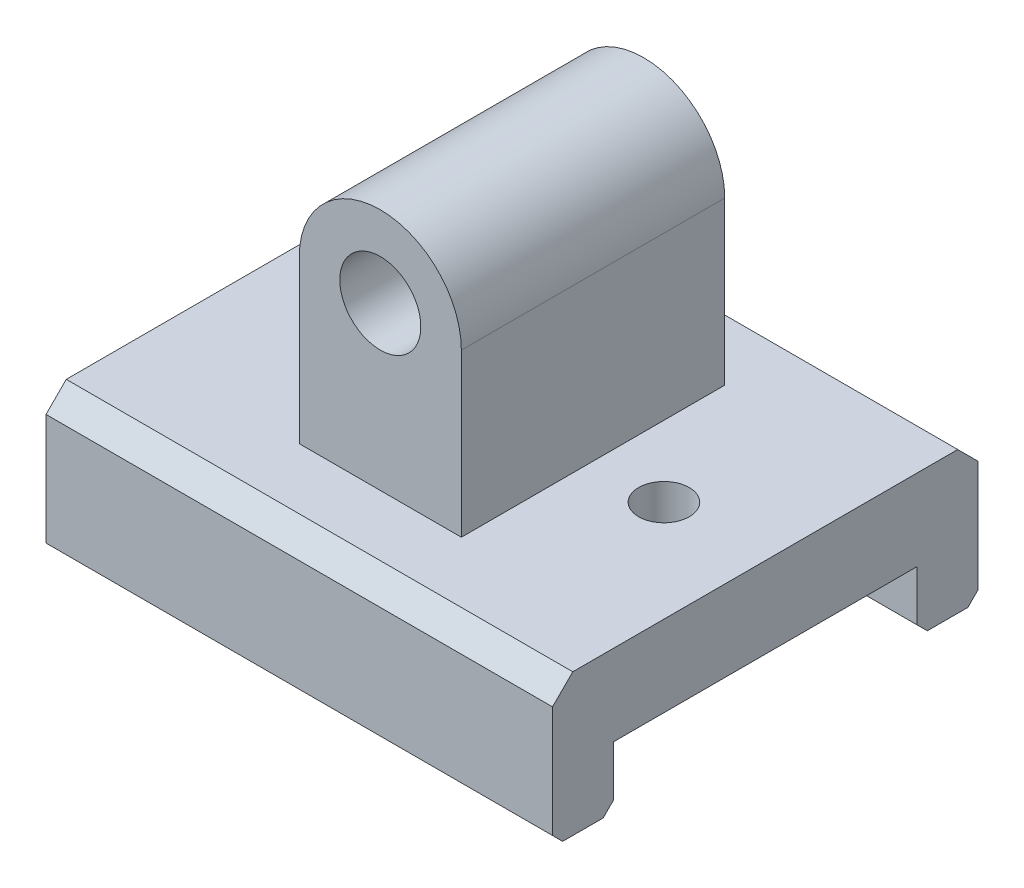
ISO-10303-21;
HEADER;
FILE_DESCRIPTION(('STEP AP214'),'2;1');
FILE_NAME('part.step','',(''),(''),'','','');
FILE_SCHEMA(('AUTOMOTIVE_DESIGN { 1 0 10303 214 1 1 1 1 }'));
ENDSEC;
DATA;
#1=APPLICATION_CONTEXT('core data for automotive mechanical design processes');
#2=APPLICATION_PROTOCOL_DEFINITION('international standard','automotive_design',2000,#1);
#3=PRODUCT_CONTEXT('',#1,'mechanical');
#4=PRODUCT('Part','Part','',(#3));
#5=PRODUCT_RELATED_PRODUCT_CATEGORY('part','',(#4));
#6=PRODUCT_DEFINITION_FORMATION('','',#4);
#7=PRODUCT_DEFINITION_CONTEXT('part definition',#1,'design');
#8=PRODUCT_DEFINITION('design','',#6,#7);
#9=PRODUCT_DEFINITION_SHAPE('','',#8);
#10=(LENGTH_UNIT() NAMED_UNIT(*) SI_UNIT(.MILLI.,.METRE.));
#11=(NAMED_UNIT(*) PLANE_ANGLE_UNIT() SI_UNIT($,.RADIAN.));
#12=(NAMED_UNIT(*) SI_UNIT($,.STERADIAN.) SOLID_ANGLE_UNIT());
#13=UNCERTAINTY_MEASURE_WITH_UNIT(LENGTH_MEASURE(1.E-05),#10,'distance_accuracy_value','');
#14=(GEOMETRIC_REPRESENTATION_CONTEXT(3) GLOBAL_UNCERTAINTY_ASSIGNED_CONTEXT((#13)) GLOBAL_UNIT_ASSIGNED_CONTEXT((#10,
#11,#12)) REPRESENTATION_CONTEXT('',''));
#15=CARTESIAN_POINT('',(0.,0.,0.));
#16=DIRECTION('',(0.,0.,1.));
#17=DIRECTION('',(1.,0.,0.));
#18=AXIS2_PLACEMENT_3D('',#15,#16,#17);
#19=CARTESIAN_POINT('',(25.,4.,-10.5));
#20=DIRECTION('',(0.,-1.,0.));
#21=DIRECTION('',(0.,0.,-1.));
#22=AXIS2_PLACEMENT_3D('',#19,#20,#21);
#23=PLANE('',#22);
#24=CARTESIAN_POINT('',(5.,4.,0.));
#25=DIRECTION('',(0.,1.,0.));
#26=DIRECTION('',(0.,0.,1.));
#27=AXIS2_PLACEMENT_3D('',#24,#25,#26);
#28=CIRCLE('',#27,1.24999999999999);
#29=CARTESIAN_POINT('',(5.,4.,1.24999999999999));
#30=VERTEX_POINT('',#29);
#31=EDGE_CURVE('E596',#30,#30,#28,.T.);
#32=ORIENTED_EDGE('',*,*,#31,.F.);
#33=EDGE_LOOP('',(#32));
#34=FACE_BOUND('',#33,.T.);
#35=CARTESIAN_POINT('',(20.,4.,0.));
#36=DIRECTION('',(0.,1.,0.));
#37=DIRECTION('',(0.,0.,1.));
#38=AXIS2_PLACEMENT_3D('',#35,#36,#37);
#39=CIRCLE('',#38,1.24999999999999);
#40=CARTESIAN_POINT('',(20.,4.,1.24999999999999));
#41=VERTEX_POINT('',#40);
#42=EDGE_CURVE('E391',#41,#41,#39,.T.);
#43=ORIENTED_EDGE('',*,*,#42,.F.);
#44=EDGE_LOOP('',(#43));
#45=FACE_BOUND('',#44,.T.);
#46=DIRECTION('',(0.,0.,1.));
#47=VECTOR('',#46,1.);
#48=CARTESIAN_POINT('',(25.,4.,-10.5));
#49=LINE('',#48,#47);
#50=CARTESIAN_POINT('',(25.,4.,-9.5));
#51=VERTEX_POINT('',#50);
#52=CARTESIAN_POINT('',(25.,4.,9.49999999999999));
#53=VERTEX_POINT('',#52);
#54=EDGE_CURVE('E211',#51,#53,#49,.T.);
#55=ORIENTED_EDGE('',*,*,#54,.F.);
#56=DIRECTION('',(-1.,0.,0.));
#57=VECTOR('',#56,1.);
#58=CARTESIAN_POINT('',(25.,4.,-9.5));
#59=LINE('',#58,#57);
#60=CARTESIAN_POINT('',(0.,4.,-9.5));
#61=VERTEX_POINT('',#60);
#62=EDGE_CURVE('E243',#51,#61,#59,.T.);
#63=ORIENTED_EDGE('',*,*,#62,.T.);
#64=DIRECTION('',(0.,0.,1.));
#65=VECTOR('',#64,1.);
#66=CARTESIAN_POINT('',(0.,4.,-10.5));
#67=LINE('',#66,#65);
#68=CARTESIAN_POINT('',(0.,4.,9.49999999999999));
#69=VERTEX_POINT('',#68);
#70=EDGE_CURVE('E228',#61,#69,#67,.T.);
#71=ORIENTED_EDGE('',*,*,#70,.T.);
#72=DIRECTION('',(1.,0.,0.));
#73=VECTOR('',#72,1.);
#74=CARTESIAN_POINT('',(25.,4.,9.49999999999999));
#75=LINE('',#74,#73);
#76=EDGE_CURVE('E241',#69,#53,#75,.T.);
#77=ORIENTED_EDGE('',*,*,#76,.T.);
#78=EDGE_LOOP('',(#55,#63,#71,#77));
#79=FACE_BOUND('',#78,.T.);
#80=DIRECTION('',(0.,0.,-1.));
#81=VECTOR('',#80,1.);
#82=CARTESIAN_POINT('',(8.5,4.,6.5));
#83=LINE('',#82,#81);
#84=CARTESIAN_POINT('',(8.5,4.,6.5));
#85=VERTEX_POINT('',#84);
#86=CARTESIAN_POINT('',(8.5,4.,-6.5));
#87=VERTEX_POINT('',#86);
#88=EDGE_CURVE('E172',#85,#87,#83,.T.);
#89=ORIENTED_EDGE('',*,*,#88,.T.);
#90=DIRECTION('',(1.,0.,0.));
#91=VECTOR('',#90,1.);
#92=CARTESIAN_POINT('',(8.5,4.,-6.5));
#93=LINE('',#92,#91);
#94=CARTESIAN_POINT('',(16.5,4.,-6.5));
#95=VERTEX_POINT('',#94);
#96=EDGE_CURVE('E408',#87,#95,#93,.T.);
#97=ORIENTED_EDGE('',*,*,#96,.T.);
#98=DIRECTION('',(0.,0.,-1.));
#99=VECTOR('',#98,1.);
#100=CARTESIAN_POINT('',(16.5,4.,6.5));
#101=LINE('',#100,#99);
#102=CARTESIAN_POINT('',(16.5,4.,6.5));
#103=VERTEX_POINT('',#102);
#104=EDGE_CURVE('E195',#103,#95,#101,.T.);
#105=ORIENTED_EDGE('',*,*,#104,.F.);
#106=DIRECTION('',(1.,0.,0.));
#107=VECTOR('',#106,1.);
#108=CARTESIAN_POINT('',(8.5,4.,6.5));
#109=LINE('',#108,#107);
#110=EDGE_CURVE('E175',#85,#103,#109,.T.);
#111=ORIENTED_EDGE('',*,*,#110,.F.);
#112=EDGE_LOOP('',(#89,#97,#105,#111));
#113=FACE_BOUND('',#112,.T.);
#114=ADVANCED_FACE('F37',(#34,#45,#79,#113),#23,.F.);
#115=CARTESIAN_POINT('',(25.,-3.,7.5));
#116=DIRECTION('',(0.,0.,1.));
#117=DIRECTION('',(1.,0.,0.));
#118=AXIS2_PLACEMENT_3D('',#115,#116,#117);
#119=PLANE('',#118);
#120=DIRECTION('',(0.,1.,0.));
#121=VECTOR('',#120,1.);
#122=CARTESIAN_POINT('',(25.,-3.,7.5));
#123=LINE('',#122,#121);
#124=CARTESIAN_POINT('',(25.,-2.5,7.5));
#125=VERTEX_POINT('',#124);
#126=CARTESIAN_POINT('',(25.,0.,7.5));
#127=VERTEX_POINT('',#126);
#128=EDGE_CURVE('E199',#125,#127,#123,.T.);
#129=ORIENTED_EDGE('',*,*,#128,.F.);
#130=DIRECTION('',(-1.,0.,0.));
#131=VECTOR('',#130,1.);
#132=CARTESIAN_POINT('',(25.,-2.5,7.5));
#133=LINE('',#132,#131);
#134=CARTESIAN_POINT('',(0.,-2.5,7.5));
#135=VERTEX_POINT('',#134);
#136=EDGE_CURVE('E11',#125,#135,#133,.T.);
#137=ORIENTED_EDGE('',*,*,#136,.T.);
#138=DIRECTION('',(0.,1.,0.));
#139=VECTOR('',#138,1.);
#140=CARTESIAN_POINT('',(0.,-3.,7.5));
#141=LINE('',#140,#139);
#142=CARTESIAN_POINT('',(0.,0.,7.5));
#143=VERTEX_POINT('',#142);
#144=EDGE_CURVE('E191',#135,#143,#141,.T.);
#145=ORIENTED_EDGE('',*,*,#144,.T.);
#146=DIRECTION('',(-1.,0.,0.));
#147=VECTOR('',#146,1.);
#148=CARTESIAN_POINT('',(25.,0.,7.5));
#149=LINE('',#148,#147);
#150=EDGE_CURVE('E238',#127,#143,#149,.T.);
#151=ORIENTED_EDGE('',*,*,#150,.F.);
#152=EDGE_LOOP('',(#129,#137,#145,#151));
#153=FACE_BOUND('',#152,.T.);
#154=ADVANCED_FACE('F315',(#153),#119,.F.);
#155=CARTESIAN_POINT('',(25.,0.,7.5));
#156=DIRECTION('',(0.,1.,0.));
#157=DIRECTION('',(0.,0.,1.));
#158=AXIS2_PLACEMENT_3D('',#155,#156,#157);
#159=PLANE('',#158);
#160=CARTESIAN_POINT('',(5.,0.,0.));
#161=DIRECTION('',(0.,1.,0.));
#162=DIRECTION('',(0.,0.,1.));
#163=AXIS2_PLACEMENT_3D('',#160,#161,#162);
#164=CIRCLE('',#163,1.24999999999999);
#165=CARTESIAN_POINT('',(5.,0.,1.24999999999999));
#166=VERTEX_POINT('',#165);
#167=EDGE_CURVE('E385',#166,#166,#164,.T.);
#168=ORIENTED_EDGE('',*,*,#167,.T.);
#169=EDGE_LOOP('',(#168));
#170=FACE_BOUND('',#169,.T.);
#171=CARTESIAN_POINT('',(20.,0.,0.));
#172=DIRECTION('',(0.,1.,0.));
#173=DIRECTION('',(0.,0.,1.));
#174=AXIS2_PLACEMENT_3D('',#171,#172,#173);
#175=CIRCLE('',#174,1.24999999999999);
#176=CARTESIAN_POINT('',(20.,0.,1.24999999999999));
#177=VERTEX_POINT('',#176);
#178=EDGE_CURVE('E388',#177,#177,#175,.T.);
#179=ORIENTED_EDGE('',*,*,#178,.T.);
#180=EDGE_LOOP('',(#179));
#181=FACE_BOUND('',#180,.T.);
#182=DIRECTION('',(0.,0.,-1.));
#183=VECTOR('',#182,1.);
#184=CARTESIAN_POINT('',(0.,0.,7.5));
#185=LINE('',#184,#183);
#186=CARTESIAN_POINT('',(0.,0.,-7.5));
#187=VERTEX_POINT('',#186);
#188=EDGE_CURVE('E193',#143,#187,#185,.T.);
#189=ORIENTED_EDGE('',*,*,#188,.T.);
#190=DIRECTION('',(-1.,0.,0.));
#191=VECTOR('',#190,1.);
#192=CARTESIAN_POINT('',(25.,0.,-7.5));
#193=LINE('',#192,#191);
#194=CARTESIAN_POINT('',(25.,0.,-7.5));
#195=VERTEX_POINT('',#194);
#196=EDGE_CURVE('E218',#195,#187,#193,.T.);
#197=ORIENTED_EDGE('',*,*,#196,.F.);
#198=DIRECTION('',(0.,0.,-1.));
#199=VECTOR('',#198,1.);
#200=CARTESIAN_POINT('',(25.,0.,7.5));
#201=LINE('',#200,#199);
#202=EDGE_CURVE('E201',#127,#195,#201,.T.);
#203=ORIENTED_EDGE('',*,*,#202,.F.);
#204=ORIENTED_EDGE('',*,*,#150,.T.);
#205=EDGE_LOOP('',(#189,#197,#203,#204));
#206=FACE_BOUND('',#205,.T.);
#207=ADVANCED_FACE('F320',(#170,#181,#206),#159,.F.);
#208=CARTESIAN_POINT('',(25.,0.,-7.5));
#209=DIRECTION('',(0.,0.,-1.));
#210=DIRECTION('',(0.,1.,0.));
#211=AXIS2_PLACEMENT_3D('',#208,#209,#210);
#212=PLANE('',#211);
#213=DIRECTION('',(0.,-1.,0.));
#214=VECTOR('',#213,1.);
#215=CARTESIAN_POINT('',(0.,0.,-7.5));
#216=LINE('',#215,#214);
#217=CARTESIAN_POINT('',(0.,-2.5,-7.5));
#218=VERTEX_POINT('',#217);
#219=EDGE_CURVE('E221',#187,#218,#216,.T.);
#220=ORIENTED_EDGE('',*,*,#219,.T.);
#221=DIRECTION('',(1.,0.,0.));
#222=VECTOR('',#221,1.);
#223=CARTESIAN_POINT('',(25.,-2.5,-7.5));
#224=LINE('',#223,#222);
#225=CARTESIAN_POINT('',(25.,-2.5,-7.5));
#226=VERTEX_POINT('',#225);
#227=EDGE_CURVE('E45',#218,#226,#224,.T.);
#228=ORIENTED_EDGE('',*,*,#227,.T.);
#229=DIRECTION('',(0.,-1.,0.));
#230=VECTOR('',#229,1.);
#231=CARTESIAN_POINT('',(25.,0.,-7.5));
#232=LINE('',#231,#230);
#233=EDGE_CURVE('E204',#195,#226,#232,.T.);
#234=ORIENTED_EDGE('',*,*,#233,.F.);
#235=ORIENTED_EDGE('',*,*,#196,.T.);
#236=EDGE_LOOP('',(#220,#228,#234,#235));
#237=FACE_BOUND('',#236,.T.);
#238=ADVANCED_FACE('F322',(#237),#212,.F.);
#239=CARTESIAN_POINT('',(25.,-3.,-7.5));
#240=DIRECTION('',(0.,1.,0.));
#241=DIRECTION('',(0.,0.,1.));
#242=AXIS2_PLACEMENT_3D('',#239,#240,#241);
#243=PLANE('',#242);
#244=DIRECTION('',(0.,0.,-1.));
#245=VECTOR('',#244,1.);
#246=CARTESIAN_POINT('',(0.,-3.,-7.5));
#247=LINE('',#246,#245);
#248=CARTESIAN_POINT('',(0.,-3.,-8.00000000000001));
#249=VERTEX_POINT('',#248);
#250=CARTESIAN_POINT('',(0.,-3.,-10.));
#251=VERTEX_POINT('',#250);
#252=EDGE_CURVE('E223',#249,#251,#247,.T.);
#253=ORIENTED_EDGE('',*,*,#252,.T.);
#254=DIRECTION('',(1.,0.,0.));
#255=VECTOR('',#254,1.);
#256=CARTESIAN_POINT('',(25.,-3.,-10.));
#257=LINE('',#256,#255);
#258=CARTESIAN_POINT('',(25.,-3.,-10.));
#259=VERTEX_POINT('',#258);
#260=EDGE_CURVE('E275',#251,#259,#257,.T.);
#261=ORIENTED_EDGE('',*,*,#260,.T.);
#262=DIRECTION('',(0.,0.,-1.));
#263=VECTOR('',#262,1.);
#264=CARTESIAN_POINT('',(25.,-3.,-7.5));
#265=LINE('',#264,#263);
#266=CARTESIAN_POINT('',(25.,-3.,-8.00000000000001));
#267=VERTEX_POINT('',#266);
#268=EDGE_CURVE('E206',#267,#259,#265,.T.);
#269=ORIENTED_EDGE('',*,*,#268,.F.);
#270=DIRECTION('',(-1.,0.,0.));
#271=VECTOR('',#270,1.);
#272=CARTESIAN_POINT('',(25.,-3.,-8.00000000000001));
#273=LINE('',#272,#271);
#274=EDGE_CURVE('E272',#267,#249,#273,.T.);
#275=ORIENTED_EDGE('',*,*,#274,.T.);
#276=EDGE_LOOP('',(#253,#261,#269,#275));
#277=FACE_BOUND('',#276,.T.);
#278=ADVANCED_FACE('F330',(#277),#243,.F.);
#279=CARTESIAN_POINT('',(25.,-3.,-10.5));
#280=DIRECTION('',(0.,0.,1.));
#281=DIRECTION('',(0.,-1.,0.));
#282=AXIS2_PLACEMENT_3D('',#279,#280,#281);
#283=PLANE('',#282);
#284=DIRECTION('',(0.,1.,0.));
#285=VECTOR('',#284,1.);
#286=CARTESIAN_POINT('',(25.,-3.,-10.5));
#287=LINE('',#286,#285);
#288=CARTESIAN_POINT('',(25.,-2.49999999999999,-10.5));
#289=VERTEX_POINT('',#288);
#290=CARTESIAN_POINT('',(25.,3.,-10.5));
#291=VERTEX_POINT('',#290);
#292=EDGE_CURVE('E209',#289,#291,#287,.T.);
#293=ORIENTED_EDGE('',*,*,#292,.F.);
#294=DIRECTION('',(-1.,0.,0.));
#295=VECTOR('',#294,1.);
#296=CARTESIAN_POINT('',(25.,-2.49999999999999,-10.5));
#297=LINE('',#296,#295);
#298=CARTESIAN_POINT('',(0.,-2.49999999999999,-10.5));
#299=VERTEX_POINT('',#298);
#300=EDGE_CURVE('E261',#289,#299,#297,.T.);
#301=ORIENTED_EDGE('',*,*,#300,.T.);
#302=DIRECTION('',(0.,1.,0.));
#303=VECTOR('',#302,1.);
#304=CARTESIAN_POINT('',(0.,-3.,-10.5));
#305=LINE('',#304,#303);
#306=CARTESIAN_POINT('',(0.,3.,-10.5));
#307=VERTEX_POINT('',#306);
#308=EDGE_CURVE('E226',#299,#307,#305,.T.);
#309=ORIENTED_EDGE('',*,*,#308,.T.);
#310=DIRECTION('',(1.,0.,0.));
#311=VECTOR('',#310,1.);
#312=CARTESIAN_POINT('',(25.,3.,-10.5));
#313=LINE('',#312,#311);
#314=EDGE_CURVE('E251',#307,#291,#313,.T.);
#315=ORIENTED_EDGE('',*,*,#314,.T.);
#316=EDGE_LOOP('',(#293,#301,#309,#315));
#317=FACE_BOUND('',#316,.T.);
#318=ADVANCED_FACE('F338',(#317),#283,.F.);
#319=CARTESIAN_POINT('',(25.,4.,10.5));
#320=DIRECTION('',(0.,0.,-1.));
#321=DIRECTION('',(-1.,0.,0.));
#322=AXIS2_PLACEMENT_3D('',#319,#320,#321);
#323=PLANE('',#322);
#324=DIRECTION('',(0.,-1.,0.));
#325=VECTOR('',#324,1.);
#326=CARTESIAN_POINT('',(0.,4.,10.5));
#327=LINE('',#326,#325);
#328=CARTESIAN_POINT('',(0.,2.99999999999999,10.5));
#329=VERTEX_POINT('',#328);
#330=CARTESIAN_POINT('',(0.,-2.49999999999999,10.5));
#331=VERTEX_POINT('',#330);
#332=EDGE_CURVE('E231',#329,#331,#327,.T.);
#333=ORIENTED_EDGE('',*,*,#332,.T.);
#334=DIRECTION('',(1.,0.,0.));
#335=VECTOR('',#334,1.);
#336=CARTESIAN_POINT('',(25.,-2.49999999999999,10.5));
#337=LINE('',#336,#335);
#338=CARTESIAN_POINT('',(25.,-2.49999999999999,10.5));
#339=VERTEX_POINT('',#338);
#340=EDGE_CURVE('E289',#331,#339,#337,.T.);
#341=ORIENTED_EDGE('',*,*,#340,.T.);
#342=DIRECTION('',(0.,-1.,0.));
#343=VECTOR('',#342,1.);
#344=CARTESIAN_POINT('',(25.,4.,10.5));
#345=LINE('',#344,#343);
#346=CARTESIAN_POINT('',(25.,2.99999999999999,10.5));
#347=VERTEX_POINT('',#346);
#348=EDGE_CURVE('E214',#347,#339,#345,.T.);
#349=ORIENTED_EDGE('',*,*,#348,.F.);
#350=DIRECTION('',(-1.,0.,0.));
#351=VECTOR('',#350,1.);
#352=CARTESIAN_POINT('',(25.,2.99999999999999,10.5));
#353=LINE('',#352,#351);
#354=EDGE_CURVE('E258',#347,#329,#353,.T.);
#355=ORIENTED_EDGE('',*,*,#354,.T.);
#356=EDGE_LOOP('',(#333,#341,#349,#355));
#357=FACE_BOUND('',#356,.T.);
#358=ADVANCED_FACE('F293',(#357),#323,.F.);
#359=CARTESIAN_POINT('',(25.,-3.,10.5));
#360=DIRECTION('',(0.,1.,0.));
#361=DIRECTION('',(0.,0.,1.));
#362=AXIS2_PLACEMENT_3D('',#359,#360,#361);
#363=PLANE('',#362);
#364=DIRECTION('',(0.,0.,-1.));
#365=VECTOR('',#364,1.);
#366=CARTESIAN_POINT('',(25.,-3.,10.5));
#367=LINE('',#366,#365);
#368=CARTESIAN_POINT('',(25.,-3.,9.99999999999999));
#369=VERTEX_POINT('',#368);
#370=CARTESIAN_POINT('',(25.,-3.,8.));
#371=VERTEX_POINT('',#370);
#372=EDGE_CURVE('E217',#369,#371,#367,.T.);
#373=ORIENTED_EDGE('',*,*,#372,.F.);
#374=DIRECTION('',(-1.,0.,0.));
#375=VECTOR('',#374,1.);
#376=CARTESIAN_POINT('',(25.,-3.,9.99999999999999));
#377=LINE('',#376,#375);
#378=CARTESIAN_POINT('',(0.,-3.,9.99999999999999));
#379=VERTEX_POINT('',#378);
#380=EDGE_CURVE('E286',#369,#379,#377,.T.);
#381=ORIENTED_EDGE('',*,*,#380,.T.);
#382=DIRECTION('',(0.,0.,-1.));
#383=VECTOR('',#382,1.);
#384=CARTESIAN_POINT('',(0.,-3.,10.5));
#385=LINE('',#384,#383);
#386=CARTESIAN_POINT('',(0.,-3.,8.));
#387=VERTEX_POINT('',#386);
#388=EDGE_CURVE('E202',#379,#387,#385,.T.);
#389=ORIENTED_EDGE('',*,*,#388,.T.);
#390=DIRECTION('',(1.,0.,0.));
#391=VECTOR('',#390,1.);
#392=CARTESIAN_POINT('',(25.,-3.,8.));
#393=LINE('',#392,#391);
#394=EDGE_CURVE('E284',#387,#371,#393,.T.);
#395=ORIENTED_EDGE('',*,*,#394,.T.);
#396=EDGE_LOOP('',(#373,#381,#389,#395));
#397=FACE_BOUND('',#396,.T.);
#398=ADVANCED_FACE('F305',(#397),#363,.F.);
#399=CARTESIAN_POINT('',(25.,0.,0.));
#400=DIRECTION('',(-1.,0.,0.));
#401=DIRECTION('',(0.,0.,1.));
#402=AXIS2_PLACEMENT_3D('',#399,#400,#401);
#403=PLANE('',#402);
#404=ORIENTED_EDGE('',*,*,#268,.T.);
#405=DIRECTION('',(0.,-0.707106781186548,0.707106781186547));
#406=VECTOR('',#405,1.);
#407=CARTESIAN_POINT('',(25.,-2.49999999999999,-10.5));
#408=LINE('',#407,#406);
#409=EDGE_CURVE('E282',#259,#289,#408,.F.);
#410=ORIENTED_EDGE('',*,*,#409,.T.);
#411=ORIENTED_EDGE('',*,*,#292,.T.);
#412=DIRECTION('',(0.,-0.707106781186547,-0.707106781186548));
#413=VECTOR('',#412,1.);
#414=CARTESIAN_POINT('',(25.,4.,-9.5));
#415=LINE('',#414,#413);
#416=EDGE_CURVE('E256',#291,#51,#415,.F.);
#417=ORIENTED_EDGE('',*,*,#416,.T.);
#418=ORIENTED_EDGE('',*,*,#54,.T.);
#419=DIRECTION('',(0.,0.707106781186546,-0.707106781186549));
#420=VECTOR('',#419,1.);
#421=CARTESIAN_POINT('',(25.,2.99999999999999,10.5));
#422=LINE('',#421,#420);
#423=EDGE_CURVE('E254',#53,#347,#422,.F.);
#424=ORIENTED_EDGE('',*,*,#423,.T.);
#425=ORIENTED_EDGE('',*,*,#348,.T.);
#426=DIRECTION('',(0.,0.70710678118655,0.707106781186545));
#427=VECTOR('',#426,1.);
#428=CARTESIAN_POINT('',(25.,-3.,9.99999999999999));
#429=LINE('',#428,#427);
#430=EDGE_CURVE('E280',#339,#369,#429,.F.);
#431=ORIENTED_EDGE('',*,*,#430,.T.);
#432=ORIENTED_EDGE('',*,*,#372,.T.);
#433=DIRECTION('',(0.,-0.707106781186544,0.707106781186551));
#434=VECTOR('',#433,1.);
#435=CARTESIAN_POINT('',(25.,-2.5,7.5));
#436=LINE('',#435,#434);
#437=EDGE_CURVE('E59',#371,#125,#436,.F.);
#438=ORIENTED_EDGE('',*,*,#437,.T.);
#439=ORIENTED_EDGE('',*,*,#128,.T.);
#440=ORIENTED_EDGE('',*,*,#202,.T.);
#441=ORIENTED_EDGE('',*,*,#233,.T.);
#442=DIRECTION('',(0.,0.707106781186548,0.707106781186548));
#443=VECTOR('',#442,1.);
#444=CARTESIAN_POINT('',(25.,-3.,-8.00000000000001));
#445=LINE('',#444,#443);
#446=EDGE_CURVE('E278',#226,#267,#445,.F.);
#447=ORIENTED_EDGE('',*,*,#446,.T.);
#448=EDGE_LOOP('',(#404,#410,#411,#417,#418,#424,#425,#431,#432,#438,#439,#440,#441,#447));
#449=FACE_BOUND('',#448,.T.);
#450=ADVANCED_FACE('F298',(#449),#403,.F.);
#451=CARTESIAN_POINT('',(0.,0.,0.));
#452=DIRECTION('',(-1.,0.,0.));
#453=DIRECTION('',(0.,0.,1.));
#454=AXIS2_PLACEMENT_3D('',#451,#452,#453);
#455=PLANE('',#454);
#456=ORIENTED_EDGE('',*,*,#308,.F.);
#457=DIRECTION('',(0.,0.707106781186548,-0.707106781186547));
#458=VECTOR('',#457,1.);
#459=CARTESIAN_POINT('',(0.,-6.5,-6.5));
#460=LINE('',#459,#458);
#461=EDGE_CURVE('E270',#299,#251,#460,.F.);
#462=ORIENTED_EDGE('',*,*,#461,.T.);
#463=ORIENTED_EDGE('',*,*,#252,.F.);
#464=DIRECTION('',(0.,-0.707106781186548,-0.707106781186548));
#465=VECTOR('',#464,1.);
#466=CARTESIAN_POINT('',(0.,2.5,-2.5));
#467=LINE('',#466,#465);
#468=EDGE_CURVE('E266',#249,#218,#467,.F.);
#469=ORIENTED_EDGE('',*,*,#468,.T.);
#470=ORIENTED_EDGE('',*,*,#219,.F.);
#471=ORIENTED_EDGE('',*,*,#188,.F.);
#472=ORIENTED_EDGE('',*,*,#144,.F.);
#473=DIRECTION('',(0.,0.707106781186544,-0.707106781186551));
#474=VECTOR('',#473,1.);
#475=CARTESIAN_POINT('',(0.,2.49999999999999,2.49999999999996));
#476=LINE('',#475,#474);
#477=EDGE_CURVE('E264',#135,#387,#476,.F.);
#478=ORIENTED_EDGE('',*,*,#477,.T.);
#479=ORIENTED_EDGE('',*,*,#388,.F.);
#480=DIRECTION('',(0.,-0.70710678118655,-0.707106781186545));
#481=VECTOR('',#480,1.);
#482=CARTESIAN_POINT('',(0.,-6.49999999999999,6.50000000000003));
#483=LINE('',#482,#481);
#484=EDGE_CURVE('E268',#379,#331,#483,.F.);
#485=ORIENTED_EDGE('',*,*,#484,.T.);
#486=ORIENTED_EDGE('',*,*,#332,.F.);
#487=DIRECTION('',(0.,-0.707106781186546,0.707106781186549));
#488=VECTOR('',#487,1.);
#489=CARTESIAN_POINT('',(0.,6.75000000000001,6.74999999999998));
#490=LINE('',#489,#488);
#491=EDGE_CURVE('E246',#329,#69,#490,.F.);
#492=ORIENTED_EDGE('',*,*,#491,.T.);
#493=ORIENTED_EDGE('',*,*,#70,.F.);
#494=DIRECTION('',(0.,0.707106781186547,0.707106781186548));
#495=VECTOR('',#494,1.);
#496=CARTESIAN_POINT('',(0.,6.75,-6.75));
#497=LINE('',#496,#495);
#498=EDGE_CURVE('E248',#61,#307,#497,.F.);
#499=ORIENTED_EDGE('',*,*,#498,.T.);
#500=EDGE_LOOP('',(#456,#462,#463,#469,#470,#471,#472,#478,#479,#485,#486,#492,#493,#499));
#501=FACE_BOUND('',#500,.T.);
#502=ADVANCED_FACE('F309',(#501),#455,.T.);
#503=CARTESIAN_POINT('',(12.5,12.,6.5));
#504=DIRECTION('',(0.,0.,1.));
#505=DIRECTION('',(1.,0.,0.));
#506=AXIS2_PLACEMENT_3D('',#503,#504,#505);
#507=PLANE('',#506);
#508=CARTESIAN_POINT('',(12.5,12.,6.5));
#509=DIRECTION('',(0.,0.,1.));
#510=DIRECTION('',(1.,0.,0.));
#511=AXIS2_PLACEMENT_3D('',#508,#509,#510);
#512=CIRCLE('',#511,4.);
#513=CARTESIAN_POINT('',(16.5,12.,6.5));
#514=VERTEX_POINT('',#513);
#515=CARTESIAN_POINT('',(8.5,12.,6.5));
#516=VERTEX_POINT('',#515);
#517=EDGE_CURVE('E176',#514,#516,#512,.T.);
#518=ORIENTED_EDGE('',*,*,#517,.T.);
#519=DIRECTION('',(0.,-1.,0.));
#520=VECTOR('',#519,1.);
#521=CARTESIAN_POINT('',(8.5,12.,6.5));
#522=LINE('',#521,#520);
#523=EDGE_CURVE('E165',#516,#85,#522,.T.);
#524=ORIENTED_EDGE('',*,*,#523,.T.);
#525=ORIENTED_EDGE('',*,*,#110,.T.);
#526=DIRECTION('',(0.,1.,0.));
#527=VECTOR('',#526,1.);
#528=CARTESIAN_POINT('',(16.5,12.,6.5));
#529=LINE('',#528,#527);
#530=EDGE_CURVE('E182',#103,#514,#529,.T.);
#531=ORIENTED_EDGE('',*,*,#530,.T.);
#532=EDGE_LOOP('',(#518,#524,#525,#531));
#533=FACE_BOUND('',#532,.T.);
#534=CARTESIAN_POINT('',(12.5,12.,6.5));
#535=DIRECTION('',(0.,0.,1.));
#536=DIRECTION('',(1.,0.,0.));
#537=AXIS2_PLACEMENT_3D('',#534,#535,#536);
#538=CIRCLE('',#537,2.);
#539=CARTESIAN_POINT('',(10.5,12.,6.5));
#540=VERTEX_POINT('',#539);
#541=EDGE_CURVE('E394',#540,#540,#538,.T.);
#542=ORIENTED_EDGE('',*,*,#541,.F.);
#543=EDGE_LOOP('',(#542));
#544=FACE_BOUND('',#543,.T.);
#545=ADVANCED_FACE('F179',(#533,#544),#507,.T.);
#546=CARTESIAN_POINT('',(12.5,12.,-6.5));
#547=DIRECTION('',(0.,0.,1.));
#548=DIRECTION('',(1.,0.,0.));
#549=AXIS2_PLACEMENT_3D('',#546,#547,#548);
#550=PLANE('',#549);
#551=CARTESIAN_POINT('',(12.5,12.,-6.5));
#552=DIRECTION('',(0.,0.,1.));
#553=DIRECTION('',(1.,0.,0.));
#554=AXIS2_PLACEMENT_3D('',#551,#552,#553);
#555=CIRCLE('',#554,4.);
#556=CARTESIAN_POINT('',(16.5,12.,-6.5));
#557=VERTEX_POINT('',#556);
#558=CARTESIAN_POINT('',(8.5,12.,-6.5));
#559=VERTEX_POINT('',#558);
#560=EDGE_CURVE('E190',#557,#559,#555,.T.);
#561=ORIENTED_EDGE('',*,*,#560,.F.);
#562=DIRECTION('',(0.,1.,0.));
#563=VECTOR('',#562,1.);
#564=CARTESIAN_POINT('',(16.5,12.,-6.5));
#565=LINE('',#564,#563);
#566=EDGE_CURVE('E186',#95,#557,#565,.T.);
#567=ORIENTED_EDGE('',*,*,#566,.F.);
#568=ORIENTED_EDGE('',*,*,#96,.F.);
#569=DIRECTION('',(0.,-1.,0.));
#570=VECTOR('',#569,1.);
#571=CARTESIAN_POINT('',(8.5,12.,-6.5));
#572=LINE('',#571,#570);
#573=EDGE_CURVE('E406',#559,#87,#572,.T.);
#574=ORIENTED_EDGE('',*,*,#573,.F.);
#575=EDGE_LOOP('',(#561,#567,#568,#574));
#576=FACE_BOUND('',#575,.T.);
#577=CARTESIAN_POINT('',(12.5,12.,-6.5));
#578=DIRECTION('',(0.,0.,1.));
#579=DIRECTION('',(1.,0.,0.));
#580=AXIS2_PLACEMENT_3D('',#577,#578,#579);
#581=CIRCLE('',#580,2.);
#582=CARTESIAN_POINT('',(10.5,12.,-6.5));
#583=VERTEX_POINT('',#582);
#584=EDGE_CURVE('E390',#583,#583,#581,.T.);
#585=ORIENTED_EDGE('',*,*,#584,.T.);
#586=EDGE_LOOP('',(#585));
#587=FACE_BOUND('',#586,.T.);
#588=ADVANCED_FACE('F417',(#576,#587),#550,.F.);
#589=CARTESIAN_POINT('',(12.5,12.,6.5));
#590=DIRECTION('',(0.,0.,-1.));
#591=DIRECTION('',(-1.,0.,0.));
#592=AXIS2_PLACEMENT_3D('',#589,#590,#591);
#593=CYLINDRICAL_SURFACE('',#592,4.);
#594=ORIENTED_EDGE('',*,*,#560,.T.);
#595=DIRECTION('',(0.,0.,-1.));
#596=VECTOR('',#595,1.);
#597=CARTESIAN_POINT('',(8.5,12.,6.5));
#598=LINE('',#597,#596);
#599=EDGE_CURVE('E170',#516,#559,#598,.T.);
#600=ORIENTED_EDGE('',*,*,#599,.F.);
#601=ORIENTED_EDGE('',*,*,#517,.F.);
#602=DIRECTION('',(0.,0.,-1.));
#603=VECTOR('',#602,1.);
#604=CARTESIAN_POINT('',(16.5,12.,6.5));
#605=LINE('',#604,#603);
#606=EDGE_CURVE('E404',#514,#557,#605,.T.);
#607=ORIENTED_EDGE('',*,*,#606,.T.);
#608=EDGE_LOOP('',(#594,#600,#601,#607));
#609=FACE_BOUND('',#608,.T.);
#610=ADVANCED_FACE('F188',(#609),#593,.T.);
#611=CARTESIAN_POINT('',(8.5,12.,6.5));
#612=DIRECTION('',(1.,0.,0.));
#613=DIRECTION('',(0.,1.,0.));
#614=AXIS2_PLACEMENT_3D('',#611,#612,#613);
#615=PLANE('',#614);
#616=ORIENTED_EDGE('',*,*,#573,.T.);
#617=ORIENTED_EDGE('',*,*,#88,.F.);
#618=ORIENTED_EDGE('',*,*,#523,.F.);
#619=ORIENTED_EDGE('',*,*,#599,.T.);
#620=EDGE_LOOP('',(#616,#617,#618,#619));
#621=FACE_BOUND('',#620,.T.);
#622=ADVANCED_FACE('F168',(#621),#615,.F.);
#623=CARTESIAN_POINT('',(16.5,12.,6.5));
#624=DIRECTION('',(-1.,0.,0.));
#625=DIRECTION('',(0.,0.,1.));
#626=AXIS2_PLACEMENT_3D('',#623,#624,#625);
#627=PLANE('',#626);
#628=ORIENTED_EDGE('',*,*,#566,.T.);
#629=ORIENTED_EDGE('',*,*,#606,.F.);
#630=ORIENTED_EDGE('',*,*,#530,.F.);
#631=ORIENTED_EDGE('',*,*,#104,.T.);
#632=EDGE_LOOP('',(#628,#629,#630,#631));
#633=FACE_BOUND('',#632,.T.);
#634=ADVANCED_FACE('F414',(#633),#627,.F.);
#635=CARTESIAN_POINT('',(12.5,12.,6.5));
#636=DIRECTION('',(0.,0.,-1.));
#637=DIRECTION('',(-1.,0.,0.));
#638=AXIS2_PLACEMENT_3D('',#635,#636,#637);
#639=CYLINDRICAL_SURFACE('',#638,2.);
#640=CARTESIAN_POINT('',(10.5,12.,6.5));
#641=CARTESIAN_POINT('',(10.5,12.,6.36458333333333));
#642=CARTESIAN_POINT('',(10.5,12.,6.22916666666667));
#643=CARTESIAN_POINT('',(10.5,12.,5.95833333333333));
#644=CARTESIAN_POINT('',(10.5,12.,5.82291666666667));
#645=CARTESIAN_POINT('',(10.5,12.,5.55208333333333));
#646=CARTESIAN_POINT('',(10.5,12.,5.41666666666667));
#647=CARTESIAN_POINT('',(10.5,12.,5.14583333333333));
#648=CARTESIAN_POINT('',(10.5,12.,5.01041666666667));
#649=CARTESIAN_POINT('',(10.5,12.,4.73958333333333));
#650=CARTESIAN_POINT('',(10.5,12.,4.60416666666667));
#651=CARTESIAN_POINT('',(10.5,12.,4.33333333333333));
#652=CARTESIAN_POINT('',(10.5,12.,4.19791666666667));
#653=CARTESIAN_POINT('',(10.5,12.,3.92708333333333));
#654=CARTESIAN_POINT('',(10.5,12.,3.79166666666667));
#655=CARTESIAN_POINT('',(10.5,12.,3.52083333333333));
#656=CARTESIAN_POINT('',(10.5,12.,3.38541666666667));
#657=CARTESIAN_POINT('',(10.5,12.,3.11458333333333));
#658=CARTESIAN_POINT('',(10.5,12.,2.97916666666667));
#659=CARTESIAN_POINT('',(10.5,12.,2.70833333333333));
#660=CARTESIAN_POINT('',(10.5,12.,2.57291666666667));
#661=CARTESIAN_POINT('',(10.5,12.,2.30208333333333));
#662=CARTESIAN_POINT('',(10.5,12.,2.16666666666667));
#663=CARTESIAN_POINT('',(10.5,12.,1.89583333333333));
#664=CARTESIAN_POINT('',(10.5,12.,1.76041666666667));
#665=CARTESIAN_POINT('',(10.5,12.,1.48958333333333));
#666=CARTESIAN_POINT('',(10.5,12.,1.35416666666667));
#667=CARTESIAN_POINT('',(10.5,12.,1.08333333333333));
#668=CARTESIAN_POINT('',(10.5,12.,0.947916666666666));
#669=CARTESIAN_POINT('',(10.5,12.,0.677083333333332));
#670=CARTESIAN_POINT('',(10.5,12.,0.541666666666666));
#671=CARTESIAN_POINT('',(10.5,12.,0.270833333333333));
#672=CARTESIAN_POINT('',(10.5,12.,0.135416666666666));
#673=CARTESIAN_POINT('',(10.5,12.,-0.135416666666668));
#674=CARTESIAN_POINT('',(10.5,12.,-0.270833333333334));
#675=CARTESIAN_POINT('',(10.5,12.,-0.541666666666668));
#676=CARTESIAN_POINT('',(10.5,12.,-0.677083333333334));
#677=CARTESIAN_POINT('',(10.5,12.,-0.947916666666667));
#678=CARTESIAN_POINT('',(10.5,12.,-1.08333333333333));
#679=CARTESIAN_POINT('',(10.5,12.,-1.35416666666667));
#680=CARTESIAN_POINT('',(10.5,12.,-1.48958333333333));
#681=CARTESIAN_POINT('',(10.5,12.,-1.76041666666667));
#682=CARTESIAN_POINT('',(10.5,12.,-1.89583333333333));
#683=CARTESIAN_POINT('',(10.5,12.,-2.16666666666667));
#684=CARTESIAN_POINT('',(10.5,12.,-2.30208333333333));
#685=CARTESIAN_POINT('',(10.5,12.,-2.57291666666667));
#686=CARTESIAN_POINT('',(10.5,12.,-2.70833333333333));
#687=CARTESIAN_POINT('',(10.5,12.,-2.97916666666667));
#688=CARTESIAN_POINT('',(10.5,12.,-3.11458333333333));
#689=CARTESIAN_POINT('',(10.5,12.,-3.38541666666667));
#690=CARTESIAN_POINT('',(10.5,12.,-3.52083333333333));
#691=CARTESIAN_POINT('',(10.5,12.,-3.79166666666667));
#692=CARTESIAN_POINT('',(10.5,12.,-3.92708333333333));
#693=CARTESIAN_POINT('',(10.5,12.,-4.19791666666667));
#694=CARTESIAN_POINT('',(10.5,12.,-4.33333333333333));
#695=CARTESIAN_POINT('',(10.5,12.,-4.60416666666667));
#696=CARTESIAN_POINT('',(10.5,12.,-4.73958333333333));
#697=CARTESIAN_POINT('',(10.5,12.,-5.01041666666667));
#698=CARTESIAN_POINT('',(10.5,12.,-5.14583333333333));
#699=CARTESIAN_POINT('',(10.5,12.,-5.41666666666667));
#700=CARTESIAN_POINT('',(10.5,12.,-5.55208333333333));
#701=CARTESIAN_POINT('',(10.5,12.,-5.82291666666667));
#702=CARTESIAN_POINT('',(10.5,12.,-5.95833333333333));
#703=CARTESIAN_POINT('',(10.5,12.,-6.22916666666667));
#704=CARTESIAN_POINT('',(10.5,12.,-6.36458333333333));
#705=CARTESIAN_POINT('',(10.5,12.,-6.5));
#706=B_SPLINE_CURVE_WITH_KNOTS('',3,(#640,#641,#642,#643,#644,#645,#646,#647,#648,#649,#650,
#651,#652,#653,#654,#655,#656,#657,#658,#659,#660,#661,#662,#663,#664,#665,#666,#667,#668,#669,
#670,#671,#672,#673,#674,#675,#676,#677,#678,#679,#680,#681,#682,#683,#684,#685,#686,#687,#688,
#689,#690,#691,#692,#693,#694,#695,#696,#697,#698,#699,#700,#701,#702,#703,#704,#705),
.UNSPECIFIED.,.F.,.F.,(4,2,2,2,2,2,2,2,2,2,2,2,2,2,2,2,2,2,2,2,2,2,2,2,2,2,2,2,2,2,2,2,4),(0.,
0.40625,0.8125,1.21875,1.625,2.03125,2.4375,2.84375,3.25,3.65625,4.0625,4.46875,4.875,5.28125,
5.6875,6.09375,6.5,6.90625,7.3125,7.71875,8.125,8.53125,8.9375,9.34375,9.75,10.15625,10.5625,
10.96875,11.375,11.78125,12.1875,12.59375,13.),.UNSPECIFIED.);
#707=EDGE_CURVE('BSEAM423',#540,#583,#706,.T.);
#708=ORIENTED_EDGE('',*,*,#541,.T.);
#709=ORIENTED_EDGE('',*,*,#584,.F.);
#710=ORIENTED_EDGE('',*,*,#707,.T.);
#711=ORIENTED_EDGE('',*,*,#707,.F.);
#712=EDGE_LOOP('',(#708,#710,#709,#711));
#713=FACE_BOUND('',#712,.T.);
#714=ADVANCED_FACE('F423',(#713),#639,.F.);
#715=CARTESIAN_POINT('',(20.,4.,0.));
#716=DIRECTION('',(0.,1.,0.));
#717=DIRECTION('',(0.,0.,1.));
#718=AXIS2_PLACEMENT_3D('',#715,#716,#717);
#719=CYLINDRICAL_SURFACE('',#718,1.24999999999999);
#720=ORIENTED_EDGE('',*,*,#42,.T.);
#721=EDGE_LOOP('',(#720));
#722=FACE_BOUND('',#721,.T.);
#723=ORIENTED_EDGE('',*,*,#178,.F.);
#724=EDGE_LOOP('',(#723));
#725=FACE_BOUND('',#724,.T.);
#726=ADVANCED_FACE('F425',(#722,#725),#719,.F.);
#727=CARTESIAN_POINT('',(5.,4.,0.));
#728=DIRECTION('',(0.,1.,0.));
#729=DIRECTION('',(0.,0.,1.));
#730=AXIS2_PLACEMENT_3D('',#727,#728,#729);
#731=CYLINDRICAL_SURFACE('',#730,1.24999999999999);
#732=ORIENTED_EDGE('',*,*,#31,.T.);
#733=EDGE_LOOP('',(#732));
#734=FACE_BOUND('',#733,.T.);
#735=ORIENTED_EDGE('',*,*,#167,.F.);
#736=EDGE_LOOP('',(#735));
#737=FACE_BOUND('',#736,.T.);
#738=ADVANCED_FACE('F358',(#734,#737),#731,.F.);
#739=CARTESIAN_POINT('',(25.,4.,-9.5));
#740=DIRECTION('',(0.,-0.707106781186548,0.707106781186547));
#741=DIRECTION('',(-1.,0.,0.));
#742=AXIS2_PLACEMENT_3D('',#739,#740,#741);
#743=PLANE('',#742);
#744=ORIENTED_EDGE('',*,*,#416,.F.);
#745=ORIENTED_EDGE('',*,*,#314,.F.);
#746=ORIENTED_EDGE('',*,*,#498,.F.);
#747=ORIENTED_EDGE('',*,*,#62,.F.);
#748=EDGE_LOOP('',(#744,#745,#746,#747));
#749=FACE_BOUND('',#748,.T.);
#750=ADVANCED_FACE('F348',(#749),#743,.F.);
#751=CARTESIAN_POINT('',(25.,2.99999999999999,10.5));
#752=DIRECTION('',(0.,-0.707106781186549,-0.707106781186546));
#753=DIRECTION('',(-1.,0.,0.));
#754=AXIS2_PLACEMENT_3D('',#751,#752,#753);
#755=PLANE('',#754);
#756=ORIENTED_EDGE('',*,*,#423,.F.);
#757=ORIENTED_EDGE('',*,*,#76,.F.);
#758=ORIENTED_EDGE('',*,*,#491,.F.);
#759=ORIENTED_EDGE('',*,*,#354,.F.);
#760=EDGE_LOOP('',(#756,#757,#758,#759));
#761=FACE_BOUND('',#760,.T.);
#762=ADVANCED_FACE('F350',(#761),#755,.F.);
#763=CARTESIAN_POINT('',(25.,-2.49999999999999,-10.5));
#764=DIRECTION('',(0.,0.707106781186547,0.707106781186548));
#765=DIRECTION('',(-1.,0.,0.));
#766=AXIS2_PLACEMENT_3D('',#763,#764,#765);
#767=PLANE('',#766);
#768=ORIENTED_EDGE('',*,*,#409,.F.);
#769=ORIENTED_EDGE('',*,*,#260,.F.);
#770=ORIENTED_EDGE('',*,*,#461,.F.);
#771=ORIENTED_EDGE('',*,*,#300,.F.);
#772=EDGE_LOOP('',(#768,#769,#770,#771));
#773=FACE_BOUND('',#772,.T.);
#774=ADVANCED_FACE('F335',(#773),#767,.F.);
#775=CARTESIAN_POINT('',(25.,-3.,9.99999999999999));
#776=DIRECTION('',(0.,0.707106781186545,-0.70710678118655));
#777=DIRECTION('',(-1.,0.,0.));
#778=AXIS2_PLACEMENT_3D('',#775,#776,#777);
#779=PLANE('',#778);
#780=ORIENTED_EDGE('',*,*,#430,.F.);
#781=ORIENTED_EDGE('',*,*,#340,.F.);
#782=ORIENTED_EDGE('',*,*,#484,.F.);
#783=ORIENTED_EDGE('',*,*,#380,.F.);
#784=EDGE_LOOP('',(#780,#781,#782,#783));
#785=FACE_BOUND('',#784,.T.);
#786=ADVANCED_FACE('F302',(#785),#779,.F.);
#787=CARTESIAN_POINT('',(25.,-3.,-8.00000000000001));
#788=DIRECTION('',(0.,0.707106781186547,-0.707106781186547));
#789=DIRECTION('',(-1.,0.,0.));
#790=AXIS2_PLACEMENT_3D('',#787,#788,#789);
#791=PLANE('',#790);
#792=ORIENTED_EDGE('',*,*,#446,.F.);
#793=ORIENTED_EDGE('',*,*,#227,.F.);
#794=ORIENTED_EDGE('',*,*,#468,.F.);
#795=ORIENTED_EDGE('',*,*,#274,.F.);
#796=EDGE_LOOP('',(#792,#793,#794,#795));
#797=FACE_BOUND('',#796,.T.);
#798=ADVANCED_FACE('F327',(#797),#791,.F.);
#799=CARTESIAN_POINT('',(25.,-2.5,7.5));
#800=DIRECTION('',(0.,0.707106781186551,0.707106781186544));
#801=DIRECTION('',(-1.,0.,0.));
#802=AXIS2_PLACEMENT_3D('',#799,#800,#801);
#803=PLANE('',#802);
#804=ORIENTED_EDGE('',*,*,#437,.F.);
#805=ORIENTED_EDGE('',*,*,#394,.F.);
#806=ORIENTED_EDGE('',*,*,#477,.F.);
#807=ORIENTED_EDGE('',*,*,#136,.F.);
#808=EDGE_LOOP('',(#804,#805,#806,#807));
#809=FACE_BOUND('',#808,.T.);
#810=ADVANCED_FACE('F39',(#809),#803,.F.);
#811=CLOSED_SHELL('',(#114,#154,#207,#238,#278,#318,#358,#398,#450,#502,#545,#588,#610,#622,
#634,#714,#726,#738,#750,#762,#774,#786,#798,#810));
#812=MANIFOLD_SOLID_BREP('B2',#811);
#813=ADVANCED_BREP_SHAPE_REPRESENTATION('',(#18,#812),#14);
#814=SHAPE_DEFINITION_REPRESENTATION(#9,#813);
ENDSEC;
END-ISO-10303-21;
